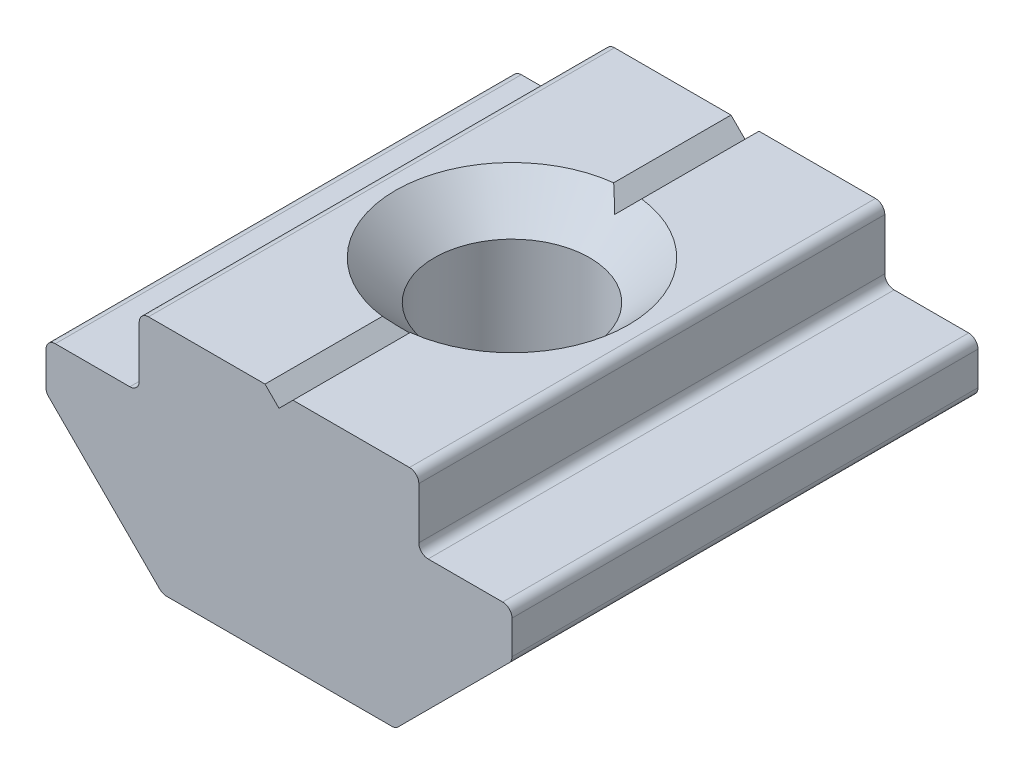
ISO-10303-21;
HEADER;
FILE_DESCRIPTION(('STEP AP214'),'2;1');
FILE_NAME('part.step','',(''),(''),'','','');
FILE_SCHEMA(('AUTOMOTIVE_DESIGN { 1 0 10303 214 1 1 1 1 }'));
ENDSEC;
DATA;
#1=APPLICATION_CONTEXT('core data for automotive mechanical design processes');
#2=APPLICATION_PROTOCOL_DEFINITION('international standard','automotive_design',2000,#1);
#3=PRODUCT_CONTEXT('',#1,'mechanical');
#4=PRODUCT('Part','Part','',(#3));
#5=PRODUCT_RELATED_PRODUCT_CATEGORY('part','',(#4));
#6=PRODUCT_DEFINITION_FORMATION('','',#4);
#7=PRODUCT_DEFINITION_CONTEXT('part definition',#1,'design');
#8=PRODUCT_DEFINITION('design','',#6,#7);
#9=PRODUCT_DEFINITION_SHAPE('','',#8);
#10=(LENGTH_UNIT() NAMED_UNIT(*) SI_UNIT(.MILLI.,.METRE.));
#11=(NAMED_UNIT(*) PLANE_ANGLE_UNIT() SI_UNIT($,.RADIAN.));
#12=(NAMED_UNIT(*) SI_UNIT($,.STERADIAN.) SOLID_ANGLE_UNIT());
#13=UNCERTAINTY_MEASURE_WITH_UNIT(LENGTH_MEASURE(1.E-05),#10,'distance_accuracy_value','');
#14=(GEOMETRIC_REPRESENTATION_CONTEXT(3) GLOBAL_UNCERTAINTY_ASSIGNED_CONTEXT((#13)) GLOBAL_UNIT_ASSIGNED_CONTEXT((#10,
#11,#12)) REPRESENTATION_CONTEXT('',''));
#15=CARTESIAN_POINT('',(0.,0.,0.));
#16=DIRECTION('',(0.,0.,1.));
#17=DIRECTION('',(1.,0.,0.));
#18=AXIS2_PLACEMENT_3D('',#15,#16,#17);
#19=CARTESIAN_POINT('',(9.84238810586418,3.3,0.));
#20=DIRECTION('',(0.,0.,1.));
#21=DIRECTION('',(1.,0.,0.));
#22=AXIS2_PLACEMENT_3D('',#19,#20,#21);
#23=CYLINDRICAL_SURFACE('',#22,0.199999999999999);
#24=CARTESIAN_POINT('',(9.84238810586418,3.3,10.));
#25=DIRECTION('',(0.,0.,1.));
#26=DIRECTION('',(1.,0.,0.));
#27=AXIS2_PLACEMENT_3D('',#24,#25,#26);
#28=CIRCLE('',#27,0.199999999999999);
#29=CARTESIAN_POINT('',(9.84238810586418,3.5,10.));
#30=VERTEX_POINT('',#29);
#31=CARTESIAN_POINT('',(10.0423881058642,3.3,10.));
#32=VERTEX_POINT('',#31);
#33=EDGE_CURVE('E146',#30,#32,#28,.F.);
#34=ORIENTED_EDGE('',*,*,#33,.T.);
#35=DIRECTION('',(0.,0.,-1.));
#36=VECTOR('',#35,1.);
#37=CARTESIAN_POINT('',(10.0423881058642,3.3,0.));
#38=LINE('',#37,#36);
#39=CARTESIAN_POINT('',(10.0423881058642,3.3,0.));
#40=VERTEX_POINT('',#39);
#41=EDGE_CURVE('E131',#40,#32,#38,.F.);
#42=ORIENTED_EDGE('',*,*,#41,.F.);
#43=CARTESIAN_POINT('',(9.84238810586418,3.3,0.));
#44=DIRECTION('',(0.,0.,1.));
#45=DIRECTION('',(1.,0.,0.));
#46=AXIS2_PLACEMENT_3D('',#43,#44,#45);
#47=CIRCLE('',#46,0.199999999999999);
#48=CARTESIAN_POINT('',(9.84238810586418,3.5,0.));
#49=VERTEX_POINT('',#48);
#50=EDGE_CURVE('E19',#40,#49,#47,.T.);
#51=ORIENTED_EDGE('',*,*,#50,.T.);
#52=DIRECTION('',(0.,0.,1.));
#53=VECTOR('',#52,1.);
#54=CARTESIAN_POINT('',(9.84238810586418,3.5,0.));
#55=LINE('',#54,#53);
#56=EDGE_CURVE('E160',#30,#49,#55,.F.);
#57=ORIENTED_EDGE('',*,*,#56,.F.);
#58=EDGE_LOOP('',(#34,#42,#51,#57));
#59=FACE_BOUND('',#58,.T.);
#60=ADVANCED_FACE('F16',(#59),#23,.T.);
#61=CARTESIAN_POINT('',(0.242388105864181,3.3,0.));
#62=DIRECTION('',(0.,0.,1.));
#63=DIRECTION('',(1.,0.,0.));
#64=AXIS2_PLACEMENT_3D('',#61,#62,#63);
#65=CYLINDRICAL_SURFACE('',#64,0.2);
#66=CARTESIAN_POINT('',(0.242388105864181,3.3,10.));
#67=DIRECTION('',(0.,0.,1.));
#68=DIRECTION('',(1.,0.,0.));
#69=AXIS2_PLACEMENT_3D('',#66,#67,#68);
#70=CIRCLE('',#69,0.2);
#71=CARTESIAN_POINT('',(0.0423881058641812,3.3,10.));
#72=VERTEX_POINT('',#71);
#73=CARTESIAN_POINT('',(0.242388105864181,3.5,10.));
#74=VERTEX_POINT('',#73);
#75=EDGE_CURVE('E227',#72,#74,#70,.F.);
#76=ORIENTED_EDGE('',*,*,#75,.T.);
#77=DIRECTION('',(0.,0.,1.));
#78=VECTOR('',#77,1.);
#79=CARTESIAN_POINT('',(0.242388105864181,3.5,0.));
#80=LINE('',#79,#78);
#81=CARTESIAN_POINT('',(0.242388105864181,3.5,0.));
#82=VERTEX_POINT('',#81);
#83=EDGE_CURVE('E156',#82,#74,#80,.T.);
#84=ORIENTED_EDGE('',*,*,#83,.F.);
#85=CARTESIAN_POINT('',(0.242388105864181,3.3,0.));
#86=DIRECTION('',(0.,0.,1.));
#87=DIRECTION('',(1.,0.,0.));
#88=AXIS2_PLACEMENT_3D('',#85,#86,#87);
#89=CIRCLE('',#88,0.2);
#90=CARTESIAN_POINT('',(0.0423881058641812,3.3,0.));
#91=VERTEX_POINT('',#90);
#92=EDGE_CURVE('E229',#82,#91,#89,.T.);
#93=ORIENTED_EDGE('',*,*,#92,.T.);
#94=DIRECTION('',(0.,0.,1.));
#95=VECTOR('',#94,1.);
#96=CARTESIAN_POINT('',(0.0423881058641812,3.3,0.));
#97=LINE('',#96,#95);
#98=EDGE_CURVE('E154',#72,#91,#97,.F.);
#99=ORIENTED_EDGE('',*,*,#98,.F.);
#100=EDGE_LOOP('',(#76,#84,#93,#99));
#101=FACE_BOUND('',#100,.T.);
#102=ADVANCED_FACE('F235',(#101),#65,.T.);
#103=CARTESIAN_POINT('',(9.84238810586418,3.5,0.));
#104=DIRECTION('',(0.,1.,0.));
#105=DIRECTION('',(0.,0.,1.));
#106=AXIS2_PLACEMENT_3D('',#103,#104,#105);
#107=PLANE('',#106);
#108=DIRECTION('',(1.,0.,0.));
#109=VECTOR('',#108,1.);
#110=CARTESIAN_POINT('',(9.84238810586418,3.5,10.));
#111=LINE('',#110,#109);
#112=CARTESIAN_POINT('',(8.24238810586418,3.5,10.));
#113=VERTEX_POINT('',#112);
#114=EDGE_CURVE('E162',#113,#30,#111,.T.);
#115=ORIENTED_EDGE('',*,*,#114,.T.);
#116=ORIENTED_EDGE('',*,*,#56,.T.);
#117=DIRECTION('',(1.,0.,0.));
#118=VECTOR('',#117,1.);
#119=CARTESIAN_POINT('',(9.84238810586418,3.5,0.));
#120=LINE('',#119,#118);
#121=CARTESIAN_POINT('',(8.24238810586418,3.5,0.));
#122=VERTEX_POINT('',#121);
#123=EDGE_CURVE('E142',#49,#122,#120,.F.);
#124=ORIENTED_EDGE('',*,*,#123,.T.);
#125=DIRECTION('',(0.,0.,1.));
#126=VECTOR('',#125,1.);
#127=CARTESIAN_POINT('',(8.24238810586418,3.5,0.));
#128=LINE('',#127,#126);
#129=EDGE_CURVE('E226',#122,#113,#128,.T.);
#130=ORIENTED_EDGE('',*,*,#129,.T.);
#131=EDGE_LOOP('',(#115,#116,#124,#130));
#132=FACE_BOUND('',#131,.T.);
#133=ADVANCED_FACE('F258',(#132),#107,.T.);
#134=CARTESIAN_POINT('',(1.84238810586418,3.5,0.));
#135=DIRECTION('',(0.,1.,0.));
#136=DIRECTION('',(0.,0.,1.));
#137=AXIS2_PLACEMENT_3D('',#134,#135,#136);
#138=PLANE('',#137);
#139=DIRECTION('',(1.,0.,0.));
#140=VECTOR('',#139,1.);
#141=CARTESIAN_POINT('',(1.84238810586418,3.5,10.));
#142=LINE('',#141,#140);
#143=CARTESIAN_POINT('',(1.84238810586418,3.5,10.));
#144=VERTEX_POINT('',#143);
#145=EDGE_CURVE('E136',#74,#144,#142,.T.);
#146=ORIENTED_EDGE('',*,*,#145,.T.);
#147=DIRECTION('',(0.,0.,1.));
#148=VECTOR('',#147,1.);
#149=CARTESIAN_POINT('',(1.84238810586418,3.5,0.));
#150=LINE('',#149,#148);
#151=CARTESIAN_POINT('',(1.84238810586418,3.5,0.));
#152=VERTEX_POINT('',#151);
#153=EDGE_CURVE('E217',#144,#152,#150,.F.);
#154=ORIENTED_EDGE('',*,*,#153,.T.);
#155=DIRECTION('',(1.,0.,0.));
#156=VECTOR('',#155,1.);
#157=CARTESIAN_POINT('',(1.84238810586418,3.5,0.));
#158=LINE('',#157,#156);
#159=EDGE_CURVE('E159',#152,#82,#158,.F.);
#160=ORIENTED_EDGE('',*,*,#159,.T.);
#161=ORIENTED_EDGE('',*,*,#83,.T.);
#162=EDGE_LOOP('',(#146,#154,#160,#161));
#163=FACE_BOUND('',#162,.T.);
#164=ADVANCED_FACE('F544',(#163),#138,.T.);
#165=CARTESIAN_POINT('',(10.0423881058642,2.58284271247462,0.));
#166=DIRECTION('',(1.,0.,0.));
#167=DIRECTION('',(0.,0.,-1.));
#168=AXIS2_PLACEMENT_3D('',#165,#166,#167);
#169=PLANE('',#168);
#170=DIRECTION('',(0.,1.,0.));
#171=VECTOR('',#170,1.);
#172=CARTESIAN_POINT('',(10.0423881058642,2.58284271247462,10.));
#173=LINE('',#172,#171);
#174=CARTESIAN_POINT('',(10.0423881058642,2.58284271247462,10.));
#175=VERTEX_POINT('',#174);
#176=EDGE_CURVE('E148',#32,#175,#173,.F.);
#177=ORIENTED_EDGE('',*,*,#176,.T.);
#178=DIRECTION('',(0.,0.,1.));
#179=VECTOR('',#178,1.);
#180=CARTESIAN_POINT('',(10.0423881058642,2.58284271247462,0.));
#181=LINE('',#180,#179);
#182=CARTESIAN_POINT('',(10.0423881058642,2.58284271247462,0.));
#183=VERTEX_POINT('',#182);
#184=EDGE_CURVE('E134',#183,#175,#181,.T.);
#185=ORIENTED_EDGE('',*,*,#184,.F.);
#186=DIRECTION('',(0.,1.,0.));
#187=VECTOR('',#186,1.);
#188=CARTESIAN_POINT('',(10.0423881058642,2.58284271247462,0.));
#189=LINE('',#188,#187);
#190=EDGE_CURVE('E127',#183,#40,#189,.T.);
#191=ORIENTED_EDGE('',*,*,#190,.T.);
#192=ORIENTED_EDGE('',*,*,#41,.T.);
#193=EDGE_LOOP('',(#177,#185,#191,#192));
#194=FACE_BOUND('',#193,.T.);
#195=ADVANCED_FACE('F129',(#194),#169,.T.);
#196=CARTESIAN_POINT('',(0.0423881058641812,3.3,0.));
#197=DIRECTION('',(-1.,0.,0.));
#198=DIRECTION('',(0.,-1.,0.));
#199=AXIS2_PLACEMENT_3D('',#196,#197,#198);
#200=PLANE('',#199);
#201=DIRECTION('',(0.,-1.,0.));
#202=VECTOR('',#201,1.);
#203=CARTESIAN_POINT('',(0.0423881058641812,3.3,10.));
#204=LINE('',#203,#202);
#205=CARTESIAN_POINT('',(0.0423881058641812,2.58284271247462,10.));
#206=VERTEX_POINT('',#205);
#207=EDGE_CURVE('E242',#206,#72,#204,.F.);
#208=ORIENTED_EDGE('',*,*,#207,.T.);
#209=ORIENTED_EDGE('',*,*,#98,.T.);
#210=DIRECTION('',(0.,-1.,0.));
#211=VECTOR('',#210,1.);
#212=CARTESIAN_POINT('',(0.0423881058641812,3.3,0.));
#213=LINE('',#212,#211);
#214=CARTESIAN_POINT('',(0.0423881058641812,2.58284271247462,0.));
#215=VERTEX_POINT('',#214);
#216=EDGE_CURVE('E150',#91,#215,#213,.T.);
#217=ORIENTED_EDGE('',*,*,#216,.T.);
#218=DIRECTION('',(0.,0.,1.));
#219=VECTOR('',#218,1.);
#220=CARTESIAN_POINT('',(0.042388105864181,2.58284271247462,0.));
#221=LINE('',#220,#219);
#222=EDGE_CURVE('E207',#206,#215,#221,.F.);
#223=ORIENTED_EDGE('',*,*,#222,.F.);
#224=EDGE_LOOP('',(#208,#209,#217,#223));
#225=FACE_BOUND('',#224,.T.);
#226=ADVANCED_FACE('F238',(#225),#200,.T.);
#227=CARTESIAN_POINT('',(8.24238810586418,3.7,0.));
#228=DIRECTION('',(0.,0.,1.));
#229=DIRECTION('',(1.,0.,0.));
#230=AXIS2_PLACEMENT_3D('',#227,#228,#229);
#231=CYLINDRICAL_SURFACE('',#230,0.199999999999999);
#232=DIRECTION('',(0.,0.,-1.));
#233=VECTOR('',#232,1.);
#234=CARTESIAN_POINT('',(8.04238810586418,3.7,0.));
#235=LINE('',#234,#233);
#236=CARTESIAN_POINT('',(8.04238810586418,3.7,10.));
#237=VERTEX_POINT('',#236);
#238=CARTESIAN_POINT('',(8.04238810586418,3.7,0.));
#239=VERTEX_POINT('',#238);
#240=EDGE_CURVE('E303',#237,#239,#235,.T.);
#241=ORIENTED_EDGE('',*,*,#240,.F.);
#242=CARTESIAN_POINT('',(8.24238810586418,3.7,10.));
#243=DIRECTION('',(0.,0.,1.));
#244=DIRECTION('',(1.,0.,0.));
#245=AXIS2_PLACEMENT_3D('',#242,#243,#244);
#246=CIRCLE('',#245,0.199999999999999);
#247=EDGE_CURVE('E223',#113,#237,#246,.F.);
#248=ORIENTED_EDGE('',*,*,#247,.F.);
#249=ORIENTED_EDGE('',*,*,#129,.F.);
#250=CARTESIAN_POINT('',(8.24238810586418,3.7,0.));
#251=DIRECTION('',(0.,0.,1.));
#252=DIRECTION('',(1.,0.,0.));
#253=AXIS2_PLACEMENT_3D('',#250,#251,#252);
#254=CIRCLE('',#253,0.199999999999999);
#255=EDGE_CURVE('E221',#239,#122,#254,.T.);
#256=ORIENTED_EDGE('',*,*,#255,.F.);
#257=EDGE_LOOP('',(#241,#248,#249,#256));
#258=FACE_BOUND('',#257,.T.);
#259=ADVANCED_FACE('F536',(#258),#231,.F.);
#260=CARTESIAN_POINT('',(1.84238810586418,3.7,0.));
#261=DIRECTION('',(0.,0.,1.));
#262=DIRECTION('',(1.,0.,0.));
#263=AXIS2_PLACEMENT_3D('',#260,#261,#262);
#264=CYLINDRICAL_SURFACE('',#263,0.2);
#265=ORIENTED_EDGE('',*,*,#153,.F.);
#266=CARTESIAN_POINT('',(1.84238810586418,3.7,10.));
#267=DIRECTION('',(0.,0.,1.));
#268=DIRECTION('',(1.,0.,0.));
#269=AXIS2_PLACEMENT_3D('',#266,#267,#268);
#270=CIRCLE('',#269,0.2);
#271=CARTESIAN_POINT('',(2.04238810586418,3.7,10.));
#272=VERTEX_POINT('',#271);
#273=EDGE_CURVE('E218',#272,#144,#270,.F.);
#274=ORIENTED_EDGE('',*,*,#273,.F.);
#275=DIRECTION('',(0.,0.,1.));
#276=VECTOR('',#275,1.);
#277=CARTESIAN_POINT('',(2.04238810586418,3.7,0.));
#278=LINE('',#277,#276);
#279=CARTESIAN_POINT('',(2.04238810586418,3.7,0.));
#280=VERTEX_POINT('',#279);
#281=EDGE_CURVE('E302',#280,#272,#278,.T.);
#282=ORIENTED_EDGE('',*,*,#281,.F.);
#283=CARTESIAN_POINT('',(1.84238810586418,3.7,0.));
#284=DIRECTION('',(0.,0.,1.));
#285=DIRECTION('',(1.,0.,0.));
#286=AXIS2_PLACEMENT_3D('',#283,#284,#285);
#287=CIRCLE('',#286,0.2);
#288=EDGE_CURVE('E214',#152,#280,#287,.T.);
#289=ORIENTED_EDGE('',*,*,#288,.F.);
#290=EDGE_LOOP('',(#265,#274,#282,#289));
#291=FACE_BOUND('',#290,.T.);
#292=ADVANCED_FACE('F533',(#291),#264,.F.);
#293=CARTESIAN_POINT('',(9.84238810586417,2.58284271247462,0.));
#294=DIRECTION('',(0.,0.,1.));
#295=DIRECTION('',(1.,0.,0.));
#296=AXIS2_PLACEMENT_3D('',#293,#294,#295);
#297=CYLINDRICAL_SURFACE('',#296,0.200000000000011);
#298=CARTESIAN_POINT('',(9.84238810586417,2.58284271247462,10.));
#299=DIRECTION('',(0.,0.,1.));
#300=DIRECTION('',(1.,0.,0.));
#301=AXIS2_PLACEMENT_3D('',#298,#299,#300);
#302=CIRCLE('',#301,0.200000000000011);
#303=CARTESIAN_POINT('',(9.98380946210149,2.44142135623731,10.));
#304=VERTEX_POINT('',#303);
#305=EDGE_CURVE('E210',#175,#304,#302,.F.);
#306=ORIENTED_EDGE('',*,*,#305,.T.);
#307=DIRECTION('',(0.,0.,1.));
#308=VECTOR('',#307,1.);
#309=CARTESIAN_POINT('',(9.98380946210149,2.44142135623731,0.));
#310=LINE('',#309,#308);
#311=CARTESIAN_POINT('',(9.98380946210149,2.44142135623731,0.));
#312=VERTEX_POINT('',#311);
#313=EDGE_CURVE('E269',#312,#304,#310,.T.);
#314=ORIENTED_EDGE('',*,*,#313,.F.);
#315=CARTESIAN_POINT('',(9.84238810586417,2.58284271247462,0.));
#316=DIRECTION('',(0.,0.,1.));
#317=DIRECTION('',(1.,0.,0.));
#318=AXIS2_PLACEMENT_3D('',#315,#316,#317);
#319=CIRCLE('',#318,0.200000000000011);
#320=EDGE_CURVE('E212',#312,#183,#319,.T.);
#321=ORIENTED_EDGE('',*,*,#320,.T.);
#322=ORIENTED_EDGE('',*,*,#184,.T.);
#323=EDGE_LOOP('',(#306,#314,#321,#322));
#324=FACE_BOUND('',#323,.T.);
#325=ADVANCED_FACE('F266',(#324),#297,.T.);
#326=CARTESIAN_POINT('',(0.242388105864181,2.58284271247462,0.));
#327=DIRECTION('',(0.,0.,1.));
#328=DIRECTION('',(1.,0.,0.));
#329=AXIS2_PLACEMENT_3D('',#326,#327,#328);
#330=CYLINDRICAL_SURFACE('',#329,0.2);
#331=CARTESIAN_POINT('',(0.242388105864181,2.58284271247462,10.));
#332=DIRECTION('',(0.,0.,1.));
#333=DIRECTION('',(1.,0.,0.));
#334=AXIS2_PLACEMENT_3D('',#331,#332,#333);
#335=CIRCLE('',#334,0.2);
#336=CARTESIAN_POINT('',(0.100966749626872,2.44142135623731,10.));
#337=VERTEX_POINT('',#336);
#338=EDGE_CURVE('E205',#337,#206,#335,.F.);
#339=ORIENTED_EDGE('',*,*,#338,.T.);
#340=ORIENTED_EDGE('',*,*,#222,.T.);
#341=CARTESIAN_POINT('',(0.242388105864181,2.58284271247462,0.));
#342=DIRECTION('',(0.,0.,1.));
#343=DIRECTION('',(1.,0.,0.));
#344=AXIS2_PLACEMENT_3D('',#341,#342,#343);
#345=CIRCLE('',#344,0.2);
#346=CARTESIAN_POINT('',(0.100966749626872,2.44142135623731,0.));
#347=VERTEX_POINT('',#346);
#348=EDGE_CURVE('E208',#215,#347,#345,.T.);
#349=ORIENTED_EDGE('',*,*,#348,.T.);
#350=DIRECTION('',(0.,0.,1.));
#351=VECTOR('',#350,1.);
#352=CARTESIAN_POINT('',(0.100966749626872,2.44142135623731,0.));
#353=LINE('',#352,#351);
#354=EDGE_CURVE('E296',#337,#347,#353,.F.);
#355=ORIENTED_EDGE('',*,*,#354,.F.);
#356=EDGE_LOOP('',(#339,#340,#349,#355));
#357=FACE_BOUND('',#356,.T.);
#358=ADVANCED_FACE('F527',(#357),#330,.T.);
#359=CARTESIAN_POINT('',(8.04238810586418,3.7,0.));
#360=DIRECTION('',(1.,0.,0.));
#361=DIRECTION('',(0.,0.,-1.));
#362=AXIS2_PLACEMENT_3D('',#359,#360,#361);
#363=PLANE('',#362);
#364=DIRECTION('',(0.,1.,0.));
#365=VECTOR('',#364,1.);
#366=CARTESIAN_POINT('',(8.04238810586418,3.7,10.));
#367=LINE('',#366,#365);
#368=CARTESIAN_POINT('',(8.04238810586418,4.8,10.));
#369=VERTEX_POINT('',#368);
#370=EDGE_CURVE('E307',#369,#237,#367,.F.);
#371=ORIENTED_EDGE('',*,*,#370,.T.);
#372=ORIENTED_EDGE('',*,*,#240,.T.);
#373=DIRECTION('',(0.,1.,0.));
#374=VECTOR('',#373,1.);
#375=CARTESIAN_POINT('',(8.04238810586418,3.7,0.));
#376=LINE('',#375,#374);
#377=CARTESIAN_POINT('',(8.04238810586418,4.8,0.));
#378=VERTEX_POINT('',#377);
#379=EDGE_CURVE('E309',#239,#378,#376,.T.);
#380=ORIENTED_EDGE('',*,*,#379,.T.);
#381=DIRECTION('',(0.,0.,1.));
#382=VECTOR('',#381,1.);
#383=CARTESIAN_POINT('',(8.04238810586418,4.8,0.));
#384=LINE('',#383,#382);
#385=EDGE_CURVE('E338',#369,#378,#384,.F.);
#386=ORIENTED_EDGE('',*,*,#385,.F.);
#387=EDGE_LOOP('',(#371,#372,#380,#386));
#388=FACE_BOUND('',#387,.T.);
#389=ADVANCED_FACE('F318',(#388),#363,.T.);
#390=CARTESIAN_POINT('',(2.04238810586418,4.8,0.));
#391=DIRECTION('',(-1.,0.,0.));
#392=DIRECTION('',(0.,-1.,0.));
#393=AXIS2_PLACEMENT_3D('',#390,#391,#392);
#394=PLANE('',#393);
#395=DIRECTION('',(0.,-1.,0.));
#396=VECTOR('',#395,1.);
#397=CARTESIAN_POINT('',(2.04238810586418,4.8,10.));
#398=LINE('',#397,#396);
#399=CARTESIAN_POINT('',(2.04238810586418,4.8,10.));
#400=VERTEX_POINT('',#399);
#401=EDGE_CURVE('E304',#272,#400,#398,.F.);
#402=ORIENTED_EDGE('',*,*,#401,.T.);
#403=DIRECTION('',(0.,0.,1.));
#404=VECTOR('',#403,1.);
#405=CARTESIAN_POINT('',(2.04238810586418,4.8,0.));
#406=LINE('',#405,#404);
#407=CARTESIAN_POINT('',(2.04238810586418,4.8,0.));
#408=VERTEX_POINT('',#407);
#409=EDGE_CURVE('E440',#408,#400,#406,.T.);
#410=ORIENTED_EDGE('',*,*,#409,.F.);
#411=DIRECTION('',(0.,-1.,0.));
#412=VECTOR('',#411,1.);
#413=CARTESIAN_POINT('',(2.04238810586418,4.8,0.));
#414=LINE('',#413,#412);
#415=EDGE_CURVE('E300',#408,#280,#414,.T.);
#416=ORIENTED_EDGE('',*,*,#415,.T.);
#417=ORIENTED_EDGE('',*,*,#281,.T.);
#418=EDGE_LOOP('',(#402,#410,#416,#417));
#419=FACE_BOUND('',#418,.T.);
#420=ADVANCED_FACE('F521',(#419),#394,.T.);
#421=CARTESIAN_POINT('',(7.60096674962688,0.0585786437626915,0.));
#422=DIRECTION('',(0.707106781186548,-0.707106781186547,0.));
#423=DIRECTION('',(0.707106781186547,0.707106781186548,0.));
#424=AXIS2_PLACEMENT_3D('',#421,#422,#423);
#425=PLANE('',#424);
#426=DIRECTION('',(0.707106781186546,0.707106781186549,0.));
#427=VECTOR('',#426,1.);
#428=CARTESIAN_POINT('',(7.60096674962688,0.0585786437626921,10.));
#429=LINE('',#428,#427);
#430=CARTESIAN_POINT('',(7.60096674962688,0.0585786437626925,10.));
#431=VERTEX_POINT('',#430);
#432=EDGE_CURVE('E187',#431,#304,#429,.T.);
#433=ORIENTED_EDGE('',*,*,#432,.F.);
#434=DIRECTION('',(0.,0.,1.));
#435=VECTOR('',#434,1.);
#436=CARTESIAN_POINT('',(7.60096674962688,0.0585786437626958,0.));
#437=LINE('',#436,#435);
#438=CARTESIAN_POINT('',(7.60096674962688,0.0585786437626925,0.));
#439=VERTEX_POINT('',#438);
#440=EDGE_CURVE('E195',#439,#431,#437,.T.);
#441=ORIENTED_EDGE('',*,*,#440,.F.);
#442=DIRECTION('',(0.707106781186546,0.707106781186549,0.));
#443=VECTOR('',#442,1.);
#444=CARTESIAN_POINT('',(7.60096674962688,0.0585786437626921,0.));
#445=LINE('',#444,#443);
#446=EDGE_CURVE('E204',#439,#312,#445,.T.);
#447=ORIENTED_EDGE('',*,*,#446,.T.);
#448=ORIENTED_EDGE('',*,*,#313,.T.);
#449=EDGE_LOOP('',(#433,#441,#447,#448));
#450=FACE_BOUND('',#449,.T.);
#451=ADVANCED_FACE('F289',(#450),#425,.T.);
#452=CARTESIAN_POINT('',(0.100966749626872,2.44142135623731,0.));
#453=DIRECTION('',(-0.707106781186547,-0.707106781186548,0.));
#454=DIRECTION('',(0.707106781186548,-0.707106781186547,0.));
#455=AXIS2_PLACEMENT_3D('',#452,#453,#454);
#456=PLANE('',#455);
#457=DIRECTION('',(0.707106781186547,-0.707106781186547,0.));
#458=VECTOR('',#457,1.);
#459=CARTESIAN_POINT('',(0.100966749626872,2.44142135623731,10.));
#460=LINE('',#459,#458);
#461=CARTESIAN_POINT('',(2.48380946210149,0.0585786437626921,10.));
#462=VERTEX_POINT('',#461);
#463=EDGE_CURVE('E191',#337,#462,#460,.T.);
#464=ORIENTED_EDGE('',*,*,#463,.F.);
#465=ORIENTED_EDGE('',*,*,#354,.T.);
#466=DIRECTION('',(0.707106781186547,-0.707106781186547,0.));
#467=VECTOR('',#466,1.);
#468=CARTESIAN_POINT('',(0.100966749626872,2.44142135623731,0.));
#469=LINE('',#468,#467);
#470=CARTESIAN_POINT('',(2.48380946210149,0.0585786437626921,0.));
#471=VERTEX_POINT('',#470);
#472=EDGE_CURVE('E280',#347,#471,#469,.T.);
#473=ORIENTED_EDGE('',*,*,#472,.T.);
#474=DIRECTION('',(0.,0.,1.));
#475=VECTOR('',#474,1.);
#476=CARTESIAN_POINT('',(2.48380946210149,0.058578643762692,0.));
#477=LINE('',#476,#475);
#478=EDGE_CURVE('E175',#462,#471,#477,.F.);
#479=ORIENTED_EDGE('',*,*,#478,.F.);
#480=EDGE_LOOP('',(#464,#465,#473,#479));
#481=FACE_BOUND('',#480,.T.);
#482=ADVANCED_FACE('F514',(#481),#456,.T.);
#483=CARTESIAN_POINT('',(5.34238810586418,5.,0.));
#484=DIRECTION('',(-0.707106781186549,0.707106781186546,0.));
#485=DIRECTION('',(-0.707106781186546,-0.707106781186549,0.));
#486=AXIS2_PLACEMENT_3D('',#483,#484,#485);
#487=PLANE('',#486);
#488=DIRECTION('',(-0.707106781186547,-0.707106781186547,0.));
#489=VECTOR('',#488,1.);
#490=CARTESIAN_POINT('',(5.34238810586418,5.,10.));
#491=LINE('',#490,#489);
#492=CARTESIAN_POINT('',(5.34238810586418,5.,10.));
#493=VERTEX_POINT('',#492);
#494=CARTESIAN_POINT('',(5.04238810586418,4.7,10.));
#495=VERTEX_POINT('',#494);
#496=EDGE_CURVE('E186',#493,#495,#491,.T.);
#497=ORIENTED_EDGE('',*,*,#496,.F.);
#498=DIRECTION('',(0.,0.,1.));
#499=VECTOR('',#498,1.);
#500=CARTESIAN_POINT('',(5.34238810586418,5.,0.));
#501=LINE('',#500,#499);
#502=CARTESIAN_POINT('',(5.34238810586418,4.99999999999773,7.48193472922337));
#503=VERTEX_POINT('',#502);
#504=EDGE_CURVE('E424',#503,#493,#501,.T.);
#505=ORIENTED_EDGE('',*,*,#504,.F.);
#506=CARTESIAN_POINT('',(5.34238810586418,5.,7.48193472919817));
#507=CARTESIAN_POINT('',(5.18335547046326,4.84096736459908,7.34096736459908));
#508=CARTESIAN_POINT('',(5.04238810586418,4.7,7.2));
#509=B_SPLINE_CURVE_WITH_KNOTS('',2,(#506,#507,#508),.UNSPECIFIED.,.F.,.F.,(3,3),(0.,1.),.UNSPECIFIED.);
#510=CARTESIAN_POINT('',(5.04238810586418,4.7,7.2));
#511=VERTEX_POINT('',#510);
#512=EDGE_CURVE('E299',#503,#511,#509,.T.);
#513=ORIENTED_EDGE('',*,*,#512,.T.);
#514=DIRECTION('',(0.,0.,1.));
#515=VECTOR('',#514,1.);
#516=CARTESIAN_POINT('',(5.04238810586418,4.7,0.));
#517=LINE('',#516,#515);
#518=EDGE_CURVE('E436',#495,#511,#517,.F.);
#519=ORIENTED_EDGE('',*,*,#518,.F.);
#520=EDGE_LOOP('',(#497,#505,#513,#519));
#521=FACE_BOUND('',#520,.T.);
#522=ADVANCED_FACE('F505',(#521),#487,.T.);
#523=CARTESIAN_POINT('',(7.84238810586418,4.8,0.));
#524=DIRECTION('',(0.,0.,1.));
#525=DIRECTION('',(1.,0.,0.));
#526=AXIS2_PLACEMENT_3D('',#523,#524,#525);
#527=CYLINDRICAL_SURFACE('',#526,0.199999999999999);
#528=CARTESIAN_POINT('',(7.84238810586418,4.8,10.));
#529=DIRECTION('',(0.,0.,1.));
#530=DIRECTION('',(1.,0.,0.));
#531=AXIS2_PLACEMENT_3D('',#528,#529,#530);
#532=CIRCLE('',#531,0.199999999999999);
#533=CARTESIAN_POINT('',(7.84238810586418,5.,10.));
#534=VERTEX_POINT('',#533);
#535=EDGE_CURVE('E183',#369,#534,#532,.T.);
#536=ORIENTED_EDGE('',*,*,#535,.F.);
#537=ORIENTED_EDGE('',*,*,#385,.T.);
#538=CARTESIAN_POINT('',(7.84238810586418,4.8,0.));
#539=DIRECTION('',(0.,0.,1.));
#540=DIRECTION('',(1.,0.,0.));
#541=AXIS2_PLACEMENT_3D('',#538,#539,#540);
#542=CIRCLE('',#541,0.199999999999999);
#543=CARTESIAN_POINT('',(7.84238810586418,5.,0.));
#544=VERTEX_POINT('',#543);
#545=EDGE_CURVE('E200',#378,#544,#542,.T.);
#546=ORIENTED_EDGE('',*,*,#545,.T.);
#547=DIRECTION('',(0.,0.,1.));
#548=VECTOR('',#547,1.);
#549=CARTESIAN_POINT('',(7.84238810586418,5.,0.));
#550=LINE('',#549,#548);
#551=EDGE_CURVE('E337',#534,#544,#550,.F.);
#552=ORIENTED_EDGE('',*,*,#551,.F.);
#553=EDGE_LOOP('',(#536,#537,#546,#552));
#554=FACE_BOUND('',#553,.T.);
#555=ADVANCED_FACE('F334',(#554),#527,.T.);
#556=CARTESIAN_POINT('',(5.34238810586418,5.,0.));
#557=DIRECTION('',(-0.707106781186549,0.707106781186546,0.));
#558=DIRECTION('',(-0.707106781186546,-0.707106781186549,0.));
#559=AXIS2_PLACEMENT_3D('',#556,#557,#558);
#560=PLANE('',#559);
#561=DIRECTION('',(-0.707106781186547,-0.707106781186547,0.));
#562=VECTOR('',#561,1.);
#563=CARTESIAN_POINT('',(5.34238810586418,5.,0.));
#564=LINE('',#563,#562);
#565=CARTESIAN_POINT('',(5.34238810586418,5.,0.));
#566=VERTEX_POINT('',#565);
#567=CARTESIAN_POINT('',(5.04238810586418,4.7,0.));
#568=VERTEX_POINT('',#567);
#569=EDGE_CURVE('E203',#566,#568,#564,.T.);
#570=ORIENTED_EDGE('',*,*,#569,.T.);
#571=DIRECTION('',(0.,0.,1.));
#572=VECTOR('',#571,1.);
#573=CARTESIAN_POINT('',(5.04238810586418,4.7,0.));
#574=LINE('',#573,#572);
#575=CARTESIAN_POINT('',(5.04238810586418,4.70000000008149,2.79999999978031));
#576=VERTEX_POINT('',#575);
#577=EDGE_CURVE('E468',#576,#568,#574,.F.);
#578=ORIENTED_EDGE('',*,*,#577,.F.);
#579=CARTESIAN_POINT('',(5.04238810586418,4.7,2.8));
#580=CARTESIAN_POINT('',(5.18335547046326,4.84096736459908,2.65903263540092));
#581=CARTESIAN_POINT('',(5.34238810586418,5.,2.51806527080183));
#582=B_SPLINE_CURVE_WITH_KNOTS('',2,(#579,#580,#581),.UNSPECIFIED.,.F.,.F.,(3,3),(0.,1.),.UNSPECIFIED.);
#583=CARTESIAN_POINT('',(5.34238810586418,4.99999999999773,2.51806527077664));
#584=VERTEX_POINT('',#583);
#585=EDGE_CURVE('E469',#576,#584,#582,.T.);
#586=ORIENTED_EDGE('',*,*,#585,.T.);
#587=DIRECTION('',(0.,0.,1.));
#588=VECTOR('',#587,1.);
#589=CARTESIAN_POINT('',(5.34238810586418,5.,0.));
#590=LINE('',#589,#588);
#591=EDGE_CURVE('E417',#566,#584,#590,.T.);
#592=ORIENTED_EDGE('',*,*,#591,.F.);
#593=EDGE_LOOP('',(#570,#578,#586,#592));
#594=FACE_BOUND('',#593,.T.);
#595=ADVANCED_FACE('F460',(#594),#560,.T.);
#596=CARTESIAN_POINT('',(5.04238810586418,4.7,0.));
#597=DIRECTION('',(0.707106781186548,0.707106781186548,0.));
#598=DIRECTION('',(-0.707106781186548,0.707106781186548,0.));
#599=AXIS2_PLACEMENT_3D('',#596,#597,#598);
#600=PLANE('',#599);
#601=DIRECTION('',(-0.707106781186549,0.707106781186547,0.));
#602=VECTOR('',#601,1.);
#603=CARTESIAN_POINT('',(5.04238810586418,4.7,0.));
#604=LINE('',#603,#602);
#605=CARTESIAN_POINT('',(4.74238810586418,5.,0.));
#606=VERTEX_POINT('',#605);
#607=EDGE_CURVE('E199',#568,#606,#604,.T.);
#608=ORIENTED_EDGE('',*,*,#607,.T.);
#609=DIRECTION('',(0.,0.,1.));
#610=VECTOR('',#609,1.);
#611=CARTESIAN_POINT('',(4.74238810586418,5.,0.));
#612=LINE('',#611,#610);
#613=CARTESIAN_POINT('',(4.74238810586418,4.99999999999773,2.51806527077664));
#614=VERTEX_POINT('',#613);
#615=EDGE_CURVE('E414',#614,#606,#612,.F.);
#616=ORIENTED_EDGE('',*,*,#615,.F.);
#617=CARTESIAN_POINT('',(4.74238810586418,5.,2.51806527080183));
#618=CARTESIAN_POINT('',(4.90142074126509,4.84096736459909,2.65903263540091));
#619=CARTESIAN_POINT('',(5.04238810586418,4.7,2.8));
#620=B_SPLINE_CURVE_WITH_KNOTS('',2,(#617,#618,#619),.UNSPECIFIED.,.F.,.F.,(3,3),(0.,1.),.UNSPECIFIED.);
#621=EDGE_CURVE('E34',#614,#576,#620,.T.);
#622=ORIENTED_EDGE('',*,*,#621,.T.);
#623=ORIENTED_EDGE('',*,*,#577,.T.);
#624=EDGE_LOOP('',(#608,#616,#622,#623));
#625=FACE_BOUND('',#624,.T.);
#626=ADVANCED_FACE('F455',(#625),#600,.T.);
#627=CARTESIAN_POINT('',(2.24238810586418,4.8,0.));
#628=DIRECTION('',(0.,0.,1.));
#629=DIRECTION('',(1.,0.,0.));
#630=AXIS2_PLACEMENT_3D('',#627,#628,#629);
#631=CYLINDRICAL_SURFACE('',#630,0.2);
#632=CARTESIAN_POINT('',(2.24238810586418,4.8,10.));
#633=DIRECTION('',(0.,0.,1.));
#634=DIRECTION('',(1.,0.,0.));
#635=AXIS2_PLACEMENT_3D('',#632,#633,#634);
#636=CIRCLE('',#635,0.2);
#637=CARTESIAN_POINT('',(2.24238810586418,5.,10.));
#638=VERTEX_POINT('',#637);
#639=EDGE_CURVE('E179',#638,#400,#636,.T.);
#640=ORIENTED_EDGE('',*,*,#639,.F.);
#641=DIRECTION('',(0.,0.,1.));
#642=VECTOR('',#641,1.);
#643=CARTESIAN_POINT('',(2.24238810586418,5.,0.));
#644=LINE('',#643,#642);
#645=CARTESIAN_POINT('',(2.24238810586418,5.,0.));
#646=VERTEX_POINT('',#645);
#647=EDGE_CURVE('E400',#646,#638,#644,.T.);
#648=ORIENTED_EDGE('',*,*,#647,.F.);
#649=CARTESIAN_POINT('',(2.24238810586418,4.8,0.));
#650=DIRECTION('',(0.,0.,1.));
#651=DIRECTION('',(1.,0.,0.));
#652=AXIS2_PLACEMENT_3D('',#649,#650,#651);
#653=CIRCLE('',#652,0.2);
#654=EDGE_CURVE('E196',#646,#408,#653,.T.);
#655=ORIENTED_EDGE('',*,*,#654,.T.);
#656=ORIENTED_EDGE('',*,*,#409,.T.);
#657=EDGE_LOOP('',(#640,#648,#655,#656));
#658=FACE_BOUND('',#657,.T.);
#659=ADVANCED_FACE('F451',(#658),#631,.T.);
#660=CARTESIAN_POINT('',(5.04238810586418,4.7,0.));
#661=DIRECTION('',(0.707106781186548,0.707106781186548,0.));
#662=DIRECTION('',(-0.707106781186548,0.707106781186548,0.));
#663=AXIS2_PLACEMENT_3D('',#660,#661,#662);
#664=PLANE('',#663);
#665=DIRECTION('',(-0.707106781186549,0.707106781186547,0.));
#666=VECTOR('',#665,1.);
#667=CARTESIAN_POINT('',(5.04238810586418,4.7,10.));
#668=LINE('',#667,#666);
#669=CARTESIAN_POINT('',(4.74238810586418,5.,10.));
#670=VERTEX_POINT('',#669);
#671=EDGE_CURVE('E182',#495,#670,#668,.T.);
#672=ORIENTED_EDGE('',*,*,#671,.F.);
#673=ORIENTED_EDGE('',*,*,#518,.T.);
#674=CARTESIAN_POINT('',(5.04238810586418,4.7,7.2));
#675=CARTESIAN_POINT('',(4.90142074126509,4.84096736459909,7.34096736459909));
#676=CARTESIAN_POINT('',(4.74238810586418,5.,7.48193472919817));
#677=B_SPLINE_CURVE_WITH_KNOTS('',2,(#674,#675,#676),.UNSPECIFIED.,.F.,.F.,(3,3),(0.,1.),.UNSPECIFIED.);
#678=CARTESIAN_POINT('',(4.74238810586418,4.99999999999773,7.48193472922337));
#679=VERTEX_POINT('',#678);
#680=EDGE_CURVE('E405',#511,#679,#677,.T.);
#681=ORIENTED_EDGE('',*,*,#680,.T.);
#682=DIRECTION('',(0.,0.,1.));
#683=VECTOR('',#682,1.);
#684=CARTESIAN_POINT('',(4.74238810586418,5.,0.));
#685=LINE('',#684,#683);
#686=EDGE_CURVE('E397',#670,#679,#685,.F.);
#687=ORIENTED_EDGE('',*,*,#686,.F.);
#688=EDGE_LOOP('',(#672,#673,#681,#687));
#689=FACE_BOUND('',#688,.T.);
#690=ADVANCED_FACE('F403',(#689),#664,.T.);
#691=CARTESIAN_POINT('',(5.04238810586418,2.5,0.));
#692=DIRECTION('',(0.,0.,1.));
#693=DIRECTION('',(1.,0.,0.));
#694=AXIS2_PLACEMENT_3D('',#691,#692,#693);
#695=PLANE('',#694);
#696=ORIENTED_EDGE('',*,*,#159,.F.);
#697=ORIENTED_EDGE('',*,*,#288,.T.);
#698=ORIENTED_EDGE('',*,*,#415,.F.);
#699=ORIENTED_EDGE('',*,*,#654,.F.);
#700=DIRECTION('',(1.,0.,0.));
#701=VECTOR('',#700,1.);
#702=CARTESIAN_POINT('',(4.74238810586418,5.,0.));
#703=LINE('',#702,#701);
#704=EDGE_CURVE('E416',#606,#646,#703,.F.);
#705=ORIENTED_EDGE('',*,*,#704,.F.);
#706=ORIENTED_EDGE('',*,*,#607,.F.);
#707=ORIENTED_EDGE('',*,*,#569,.F.);
#708=DIRECTION('',(1.,0.,0.));
#709=VECTOR('',#708,1.);
#710=CARTESIAN_POINT('',(7.84238810586418,5.,0.));
#711=LINE('',#710,#709);
#712=EDGE_CURVE('E328',#544,#566,#711,.F.);
#713=ORIENTED_EDGE('',*,*,#712,.F.);
#714=ORIENTED_EDGE('',*,*,#545,.F.);
#715=ORIENTED_EDGE('',*,*,#379,.F.);
#716=ORIENTED_EDGE('',*,*,#255,.T.);
#717=ORIENTED_EDGE('',*,*,#123,.F.);
#718=ORIENTED_EDGE('',*,*,#50,.F.);
#719=ORIENTED_EDGE('',*,*,#190,.F.);
#720=ORIENTED_EDGE('',*,*,#320,.F.);
#721=ORIENTED_EDGE('',*,*,#446,.F.);
#722=CARTESIAN_POINT('',(7.45954539338956,0.200000000000006,0.));
#723=DIRECTION('',(0.,0.,1.));
#724=DIRECTION('',(1.,0.,0.));
#725=AXIS2_PLACEMENT_3D('',#722,#723,#724);
#726=CIRCLE('',#725,0.200000000000005);
#727=CARTESIAN_POINT('',(7.45954539338957,0.,0.));
#728=VERTEX_POINT('',#727);
#729=EDGE_CURVE('E192',#728,#439,#726,.T.);
#730=ORIENTED_EDGE('',*,*,#729,.F.);
#731=DIRECTION('',(1.,0.,0.));
#732=VECTOR('',#731,1.);
#733=CARTESIAN_POINT('',(2.6252308183388,0.,0.));
#734=LINE('',#733,#732);
#735=CARTESIAN_POINT('',(2.6252308183388,0.,0.));
#736=VERTEX_POINT('',#735);
#737=EDGE_CURVE('E406',#736,#728,#734,.T.);
#738=ORIENTED_EDGE('',*,*,#737,.F.);
#739=CARTESIAN_POINT('',(2.6252308183388,0.200000000000002,0.));
#740=DIRECTION('',(0.,0.,1.));
#741=DIRECTION('',(1.,0.,0.));
#742=AXIS2_PLACEMENT_3D('',#739,#740,#741);
#743=CIRCLE('',#742,0.200000000000001);
#744=EDGE_CURVE('E176',#471,#736,#743,.T.);
#745=ORIENTED_EDGE('',*,*,#744,.F.);
#746=ORIENTED_EDGE('',*,*,#472,.F.);
#747=ORIENTED_EDGE('',*,*,#348,.F.);
#748=ORIENTED_EDGE('',*,*,#216,.F.);
#749=ORIENTED_EDGE('',*,*,#92,.F.);
#750=EDGE_LOOP('',(#696,#697,#698,#699,#705,#706,#707,#713,#714,#715,#716,#717,#718,#719,#720,
#721,#730,#738,#745,#746,#747,#748,#749));
#751=FACE_BOUND('',#750,.T.);
#752=ADVANCED_FACE('F140',(#751),#695,.F.);
#753=CARTESIAN_POINT('',(7.45954539338956,0.200000000000006,0.));
#754=DIRECTION('',(0.,0.,1.));
#755=DIRECTION('',(1.,0.,0.));
#756=AXIS2_PLACEMENT_3D('',#753,#754,#755);
#757=CYLINDRICAL_SURFACE('',#756,0.200000000000005);
#758=CARTESIAN_POINT('',(7.45954539338956,0.200000000000006,10.));
#759=DIRECTION('',(0.,0.,1.));
#760=DIRECTION('',(1.,0.,0.));
#761=AXIS2_PLACEMENT_3D('',#758,#759,#760);
#762=CIRCLE('',#761,0.200000000000005);
#763=CARTESIAN_POINT('',(7.45954539338957,0.,10.));
#764=VERTEX_POINT('',#763);
#765=EDGE_CURVE('E188',#764,#431,#762,.T.);
#766=ORIENTED_EDGE('',*,*,#765,.F.);
#767=DIRECTION('',(0.,0.,1.));
#768=VECTOR('',#767,1.);
#769=CARTESIAN_POINT('',(7.45954539338957,0.,0.));
#770=LINE('',#769,#768);
#771=EDGE_CURVE('E287',#728,#764,#770,.T.);
#772=ORIENTED_EDGE('',*,*,#771,.F.);
#773=ORIENTED_EDGE('',*,*,#729,.T.);
#774=ORIENTED_EDGE('',*,*,#440,.T.);
#775=EDGE_LOOP('',(#766,#772,#773,#774));
#776=FACE_BOUND('',#775,.T.);
#777=ADVANCED_FACE('F285',(#776),#757,.T.);
#778=CARTESIAN_POINT('',(5.04238810586418,2.5,10.));
#779=DIRECTION('',(0.,0.,1.));
#780=DIRECTION('',(1.,0.,0.));
#781=AXIS2_PLACEMENT_3D('',#778,#779,#780);
#782=PLANE('',#781);
#783=ORIENTED_EDGE('',*,*,#273,.T.);
#784=ORIENTED_EDGE('',*,*,#145,.F.);
#785=ORIENTED_EDGE('',*,*,#75,.F.);
#786=ORIENTED_EDGE('',*,*,#207,.F.);
#787=ORIENTED_EDGE('',*,*,#338,.F.);
#788=ORIENTED_EDGE('',*,*,#463,.T.);
#789=CARTESIAN_POINT('',(2.6252308183388,0.200000000000002,10.));
#790=DIRECTION('',(0.,0.,1.));
#791=DIRECTION('',(1.,0.,0.));
#792=AXIS2_PLACEMENT_3D('',#789,#790,#791);
#793=CIRCLE('',#792,0.200000000000001);
#794=CARTESIAN_POINT('',(2.6252308183388,0.,10.));
#795=VERTEX_POINT('',#794);
#796=EDGE_CURVE('E172',#795,#462,#793,.F.);
#797=ORIENTED_EDGE('',*,*,#796,.F.);
#798=DIRECTION('',(1.,0.,0.));
#799=VECTOR('',#798,1.);
#800=CARTESIAN_POINT('',(2.6252308183388,0.,10.));
#801=LINE('',#800,#799);
#802=EDGE_CURVE('E431',#764,#795,#801,.F.);
#803=ORIENTED_EDGE('',*,*,#802,.F.);
#804=ORIENTED_EDGE('',*,*,#765,.T.);
#805=ORIENTED_EDGE('',*,*,#432,.T.);
#806=ORIENTED_EDGE('',*,*,#305,.F.);
#807=ORIENTED_EDGE('',*,*,#176,.F.);
#808=ORIENTED_EDGE('',*,*,#33,.F.);
#809=ORIENTED_EDGE('',*,*,#114,.F.);
#810=ORIENTED_EDGE('',*,*,#247,.T.);
#811=ORIENTED_EDGE('',*,*,#370,.F.);
#812=ORIENTED_EDGE('',*,*,#535,.T.);
#813=DIRECTION('',(1.,0.,0.));
#814=VECTOR('',#813,1.);
#815=CARTESIAN_POINT('',(7.84238810586418,5.,10.));
#816=LINE('',#815,#814);
#817=EDGE_CURVE('E426',#493,#534,#816,.T.);
#818=ORIENTED_EDGE('',*,*,#817,.F.);
#819=ORIENTED_EDGE('',*,*,#496,.T.);
#820=ORIENTED_EDGE('',*,*,#671,.T.);
#821=DIRECTION('',(1.,0.,0.));
#822=VECTOR('',#821,1.);
#823=CARTESIAN_POINT('',(4.74238810586418,5.,10.));
#824=LINE('',#823,#822);
#825=EDGE_CURVE('E386',#638,#670,#824,.T.);
#826=ORIENTED_EDGE('',*,*,#825,.F.);
#827=ORIENTED_EDGE('',*,*,#639,.T.);
#828=ORIENTED_EDGE('',*,*,#401,.F.);
#829=EDGE_LOOP('',(#783,#784,#785,#786,#787,#788,#797,#803,#804,#805,#806,#807,#808,#809,#810,
#811,#812,#818,#819,#820,#826,#827,#828));
#830=FACE_BOUND('',#829,.T.);
#831=ADVANCED_FACE('F262',(#830),#782,.T.);
#832=CARTESIAN_POINT('',(2.6252308183388,0.200000000000002,0.));
#833=DIRECTION('',(0.,0.,1.));
#834=DIRECTION('',(1.,0.,0.));
#835=AXIS2_PLACEMENT_3D('',#832,#833,#834);
#836=CYLINDRICAL_SURFACE('',#835,0.200000000000001);
#837=ORIENTED_EDGE('',*,*,#796,.T.);
#838=ORIENTED_EDGE('',*,*,#478,.T.);
#839=ORIENTED_EDGE('',*,*,#744,.T.);
#840=DIRECTION('',(0.,0.,1.));
#841=VECTOR('',#840,1.);
#842=CARTESIAN_POINT('',(2.6252308183388,0.,0.));
#843=LINE('',#842,#841);
#844=EDGE_CURVE('E171',#795,#736,#843,.F.);
#845=ORIENTED_EDGE('',*,*,#844,.F.);
#846=EDGE_LOOP('',(#837,#838,#839,#845));
#847=FACE_BOUND('',#846,.T.);
#848=ADVANCED_FACE('F576',(#847),#836,.T.);
#849=CARTESIAN_POINT('',(7.84238810586418,5.,0.));
#850=DIRECTION('',(0.,1.,0.));
#851=DIRECTION('',(0.,0.,1.));
#852=AXIS2_PLACEMENT_3D('',#849,#850,#851);
#853=PLANE('',#852);
#854=ORIENTED_EDGE('',*,*,#712,.T.);
#855=ORIENTED_EDGE('',*,*,#591,.T.);
#856=CARTESIAN_POINT('',(5.04238810586418,4.99999999999545,5.));
#857=DIRECTION('',(0.,1.,0.));
#858=DIRECTION('',(0.,0.,1.));
#859=AXIS2_PLACEMENT_3D('',#856,#857,#858);
#860=CIRCLE('',#859,2.50000000005002);
#861=EDGE_CURVE('E168',#584,#503,#860,.F.);
#862=ORIENTED_EDGE('',*,*,#861,.T.);
#863=ORIENTED_EDGE('',*,*,#504,.T.);
#864=ORIENTED_EDGE('',*,*,#817,.T.);
#865=ORIENTED_EDGE('',*,*,#551,.T.);
#866=EDGE_LOOP('',(#854,#855,#862,#863,#864,#865));
#867=FACE_BOUND('',#866,.T.);
#868=ADVANCED_FACE('F573',(#867),#853,.T.);
#869=CARTESIAN_POINT('',(4.74238810586418,5.,0.));
#870=DIRECTION('',(0.,1.,0.));
#871=DIRECTION('',(0.,0.,1.));
#872=AXIS2_PLACEMENT_3D('',#869,#870,#871);
#873=PLANE('',#872);
#874=ORIENTED_EDGE('',*,*,#825,.T.);
#875=ORIENTED_EDGE('',*,*,#686,.T.);
#876=CARTESIAN_POINT('',(5.04238810586418,4.99999999999545,5.));
#877=DIRECTION('',(0.,1.,0.));
#878=DIRECTION('',(0.,0.,1.));
#879=AXIS2_PLACEMENT_3D('',#876,#877,#878);
#880=CIRCLE('',#879,2.50000000005002);
#881=EDGE_CURVE('E165',#679,#614,#880,.F.);
#882=ORIENTED_EDGE('',*,*,#881,.T.);
#883=ORIENTED_EDGE('',*,*,#615,.T.);
#884=ORIENTED_EDGE('',*,*,#704,.T.);
#885=ORIENTED_EDGE('',*,*,#647,.T.);
#886=EDGE_LOOP('',(#874,#875,#882,#883,#884,#885));
#887=FACE_BOUND('',#886,.T.);
#888=ADVANCED_FACE('F396',(#887),#873,.T.);
#889=CARTESIAN_POINT('',(2.6252308183388,0.,0.));
#890=DIRECTION('',(0.,-1.,0.));
#891=DIRECTION('',(1.,0.,0.));
#892=AXIS2_PLACEMENT_3D('',#889,#890,#891);
#893=PLANE('',#892);
#894=CARTESIAN_POINT('',(5.04238810586418,0.,5.));
#895=DIRECTION('',(0.,-1.,0.));
#896=DIRECTION('',(0.,0.,-1.));
#897=AXIS2_PLACEMENT_3D('',#894,#895,#896);
#898=CIRCLE('',#897,1.666);
#899=CARTESIAN_POINT('',(5.04238810586418,0.,3.334));
#900=VERTEX_POINT('',#899);
#901=EDGE_CURVE('E25',#900,#900,#898,.F.);
#902=ORIENTED_EDGE('',*,*,#901,.T.);
#903=EDGE_LOOP('',(#902));
#904=FACE_BOUND('',#903,.T.);
#905=ORIENTED_EDGE('',*,*,#802,.T.);
#906=ORIENTED_EDGE('',*,*,#844,.T.);
#907=ORIENTED_EDGE('',*,*,#737,.T.);
#908=ORIENTED_EDGE('',*,*,#771,.T.);
#909=EDGE_LOOP('',(#905,#906,#907,#908));
#910=FACE_BOUND('',#909,.T.);
#911=ADVANCED_FACE('F562',(#904,#910),#893,.T.);
#912=CARTESIAN_POINT('',(5.04238810586418,4.99999999988177,5.));
#913=DIRECTION('',(0.,1.,0.));
#914=DIRECTION('',(0.,0.,1.));
#915=AXIS2_PLACEMENT_3D('',#912,#913,#914);
#916=CONICAL_SURFACE('',#915,2.49999999993634,0.785398163397448);
#917=CARTESIAN_POINT('',(5.04238810586418,4.166,5.));
#918=DIRECTION('',(0.,-1.,0.));
#919=DIRECTION('',(0.,0.,-1.));
#920=AXIS2_PLACEMENT_3D('',#917,#918,#919);
#921=CIRCLE('',#920,1.666);
#922=CARTESIAN_POINT('',(5.04238810586418,4.166,3.334));
#923=VERTEX_POINT('',#922);
#924=EDGE_CURVE('E10',#923,#923,#921,.T.);
#925=ORIENTED_EDGE('',*,*,#924,.T.);
#926=EDGE_LOOP('',(#925));
#927=FACE_BOUND('',#926,.T.);
#928=ORIENTED_EDGE('',*,*,#585,.F.);
#929=ORIENTED_EDGE('',*,*,#621,.F.);
#930=ORIENTED_EDGE('',*,*,#881,.F.);
#931=ORIENTED_EDGE('',*,*,#680,.F.);
#932=ORIENTED_EDGE('',*,*,#512,.F.);
#933=ORIENTED_EDGE('',*,*,#861,.F.);
#934=EDGE_LOOP('',(#928,#929,#930,#931,#932,#933));
#935=FACE_BOUND('',#934,.T.);
#936=ADVANCED_FACE('F556',(#927,#935),#916,.F.);
#937=CARTESIAN_POINT('',(5.04238810586418,2.25,5.));
#938=DIRECTION('',(0.,-1.,0.));
#939=DIRECTION('',(0.,0.,-1.));
#940=AXIS2_PLACEMENT_3D('',#937,#938,#939);
#941=CYLINDRICAL_SURFACE('',#940,1.666);
#942=ORIENTED_EDGE('',*,*,#901,.F.);
#943=EDGE_LOOP('',(#942));
#944=FACE_BOUND('',#943,.T.);
#945=ORIENTED_EDGE('',*,*,#924,.F.);
#946=EDGE_LOOP('',(#945));
#947=FACE_BOUND('',#946,.T.);
#948=ADVANCED_FACE('F554',(#944,#947),#941,.F.);
#949=CLOSED_SHELL('',(#60,#102,#133,#164,#195,#226,#259,#292,#325,#358,#389,#420,#451,#482,#522,
#555,#595,#626,#659,#690,#752,#777,#831,#848,#868,#888,#911,#936,#948));
#950=MANIFOLD_SOLID_BREP('B1',#949);
#951=ADVANCED_BREP_SHAPE_REPRESENTATION('',(#18,#950),#14);
#952=SHAPE_DEFINITION_REPRESENTATION(#9,#951);
ENDSEC;
END-ISO-10303-21;
